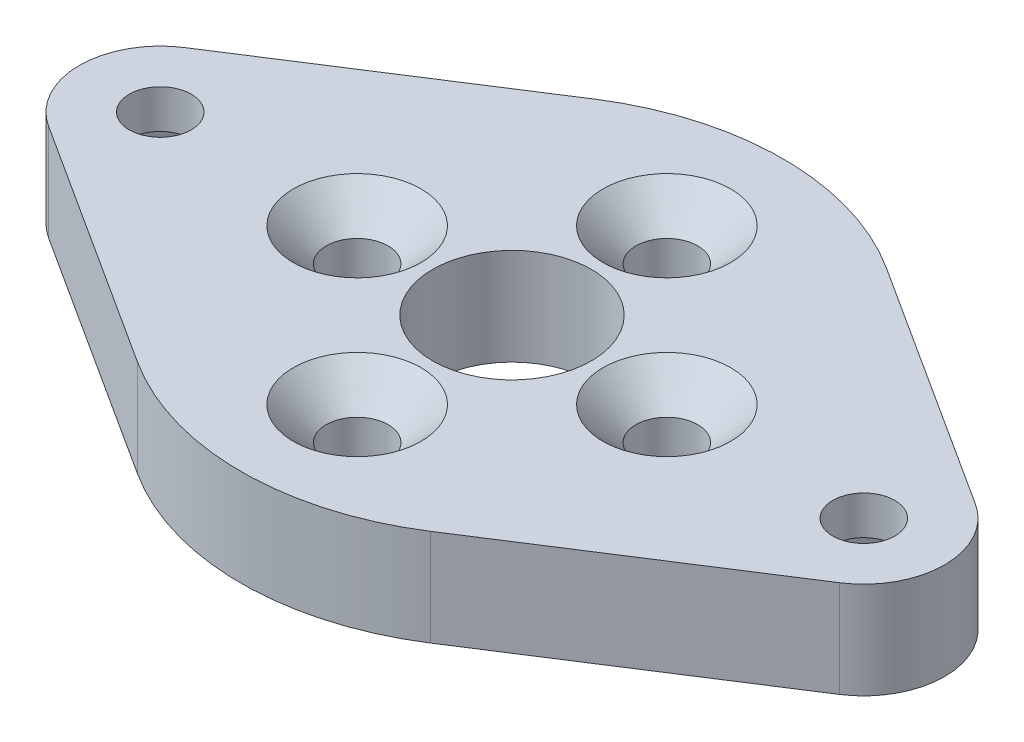
ISO-10303-21;
HEADER;
FILE_DESCRIPTION(('STEP AP214'),'2;1');
FILE_NAME('part.step','',(''),(''),'','','');
FILE_SCHEMA(('AUTOMOTIVE_DESIGN { 1 0 10303 214 1 1 1 1 }'));
ENDSEC;
DATA;
#1=APPLICATION_CONTEXT('core data for automotive mechanical design processes');
#2=APPLICATION_PROTOCOL_DEFINITION('international standard','automotive_design',2000,#1);
#3=PRODUCT_CONTEXT('',#1,'mechanical');
#4=PRODUCT('Part','Part','',(#3));
#5=PRODUCT_RELATED_PRODUCT_CATEGORY('part','',(#4));
#6=PRODUCT_DEFINITION_FORMATION('','',#4);
#7=PRODUCT_DEFINITION_CONTEXT('part definition',#1,'design');
#8=PRODUCT_DEFINITION('design','',#6,#7);
#9=PRODUCT_DEFINITION_SHAPE('','',#8);
#10=(LENGTH_UNIT() NAMED_UNIT(*) SI_UNIT(.MILLI.,.METRE.));
#11=(NAMED_UNIT(*) PLANE_ANGLE_UNIT() SI_UNIT($,.RADIAN.));
#12=(NAMED_UNIT(*) SI_UNIT($,.STERADIAN.) SOLID_ANGLE_UNIT());
#13=UNCERTAINTY_MEASURE_WITH_UNIT(LENGTH_MEASURE(1.E-05),#10,'distance_accuracy_value','');
#14=(GEOMETRIC_REPRESENTATION_CONTEXT(3) GLOBAL_UNCERTAINTY_ASSIGNED_CONTEXT((#13)) GLOBAL_UNIT_ASSIGNED_CONTEXT((#10,
#11,#12)) REPRESENTATION_CONTEXT('',''));
#15=CARTESIAN_POINT('',(0.,0.,0.));
#16=DIRECTION('',(0.,0.,1.));
#17=DIRECTION('',(1.,0.,0.));
#18=AXIS2_PLACEMENT_3D('',#15,#16,#17);
#19=CARTESIAN_POINT('',(-18.1754264805429,5.,0.));
#20=DIRECTION('',(0.,-1.,0.));
#21=DIRECTION('',(0.,0.,-1.));
#22=AXIS2_PLACEMENT_3D('',#19,#20,#21);
#23=CYLINDRICAL_SURFACE('',#22,1.6);
#24=CARTESIAN_POINT('',(-18.1754264805429,5.,0.));
#25=DIRECTION('',(0.,1.,0.));
#26=DIRECTION('',(0.,0.,1.));
#27=AXIS2_PLACEMENT_3D('',#24,#25,#26);
#28=CIRCLE('',#27,1.6);
#29=CARTESIAN_POINT('',(-18.1754264805429,5.,1.6));
#30=VERTEX_POINT('',#29);
#31=EDGE_CURVE('E284',#30,#30,#28,.T.);
#32=ORIENTED_EDGE('',*,*,#31,.T.);
#33=EDGE_LOOP('',(#32));
#34=FACE_BOUND('',#33,.T.);
#35=CARTESIAN_POINT('',(-18.1754264805429,3.,0.));
#36=DIRECTION('',(0.,-1.,0.));
#37=DIRECTION('',(0.,0.,-1.));
#38=AXIS2_PLACEMENT_3D('',#35,#36,#37);
#39=CIRCLE('',#38,1.6);
#40=CARTESIAN_POINT('',(-18.1754264805429,3.,-1.6));
#41=VERTEX_POINT('',#40);
#42=EDGE_CURVE('E42',#41,#41,#39,.T.);
#43=ORIENTED_EDGE('',*,*,#42,.T.);
#44=EDGE_LOOP('',(#43));
#45=FACE_BOUND('',#44,.T.);
#46=ADVANCED_FACE('F37',(#34,#45),#23,.F.);
#47=CARTESIAN_POINT('',(18.1754264805429,5.,0.));
#48=DIRECTION('',(0.,-1.,0.));
#49=DIRECTION('',(0.,0.,-1.));
#50=AXIS2_PLACEMENT_3D('',#47,#48,#49);
#51=CYLINDRICAL_SURFACE('',#50,1.6);
#52=CARTESIAN_POINT('',(18.1754264805429,5.,0.));
#53=DIRECTION('',(0.,1.,0.));
#54=DIRECTION('',(0.,0.,1.));
#55=AXIS2_PLACEMENT_3D('',#52,#53,#54);
#56=CIRCLE('',#55,1.6);
#57=CARTESIAN_POINT('',(18.1754264805429,5.,1.59999999999999));
#58=VERTEX_POINT('',#57);
#59=EDGE_CURVE('E281',#58,#58,#56,.T.);
#60=ORIENTED_EDGE('',*,*,#59,.T.);
#61=EDGE_LOOP('',(#60));
#62=FACE_BOUND('',#61,.T.);
#63=CARTESIAN_POINT('',(18.1754264805429,3.,0.));
#64=DIRECTION('',(0.,-1.,0.));
#65=DIRECTION('',(0.,0.,-1.));
#66=AXIS2_PLACEMENT_3D('',#63,#64,#65);
#67=CIRCLE('',#66,1.6);
#68=CARTESIAN_POINT('',(18.1754264805429,3.,-1.60000000000001));
#69=VERTEX_POINT('',#68);
#70=EDGE_CURVE('E225',#69,#69,#67,.T.);
#71=ORIENTED_EDGE('',*,*,#70,.T.);
#72=EDGE_LOOP('',(#71));
#73=FACE_BOUND('',#72,.T.);
#74=ADVANCED_FACE('F395',(#62,#73),#51,.F.);
#75=CARTESIAN_POINT('',(18.1754264805429,5.,0.));
#76=DIRECTION('',(0.,-1.,0.));
#77=DIRECTION('',(0.,0.,-1.));
#78=AXIS2_PLACEMENT_3D('',#75,#76,#77);
#79=PLANE('',#78);
#80=CARTESIAN_POINT('',(-8.,5.,0.));
#81=DIRECTION('',(0.,-1.,0.));
#82=DIRECTION('',(0.,0.,-1.));
#83=AXIS2_PLACEMENT_3D('',#80,#81,#82);
#84=CIRCLE('',#83,3.30000000000001);
#85=CARTESIAN_POINT('',(-8.,5.,-3.30000000000001));
#86=VERTEX_POINT('',#85);
#87=EDGE_CURVE('E372',#86,#86,#84,.T.);
#88=ORIENTED_EDGE('',*,*,#87,.T.);
#89=EDGE_LOOP('',(#88));
#90=FACE_BOUND('',#89,.T.);
#91=CARTESIAN_POINT('',(0.,5.,-8.));
#92=DIRECTION('',(0.,-1.,0.));
#93=DIRECTION('',(0.,0.,-1.));
#94=AXIS2_PLACEMENT_3D('',#91,#92,#93);
#95=CIRCLE('',#94,3.30000000000001);
#96=CARTESIAN_POINT('',(0.,5.,-11.3));
#97=VERTEX_POINT('',#96);
#98=EDGE_CURVE('E369',#97,#97,#95,.T.);
#99=ORIENTED_EDGE('',*,*,#98,.T.);
#100=EDGE_LOOP('',(#99));
#101=FACE_BOUND('',#100,.T.);
#102=CARTESIAN_POINT('',(8.,5.,0.));
#103=DIRECTION('',(0.,-1.,0.));
#104=DIRECTION('',(0.,0.,-1.));
#105=AXIS2_PLACEMENT_3D('',#102,#103,#104);
#106=CIRCLE('',#105,3.30000000000001);
#107=CARTESIAN_POINT('',(8.,5.,-3.30000000000001));
#108=VERTEX_POINT('',#107);
#109=EDGE_CURVE('E366',#108,#108,#106,.T.);
#110=ORIENTED_EDGE('',*,*,#109,.T.);
#111=EDGE_LOOP('',(#110));
#112=FACE_BOUND('',#111,.T.);
#113=CARTESIAN_POINT('',(0.,5.,8.));
#114=DIRECTION('',(0.,-1.,0.));
#115=DIRECTION('',(0.,0.,-1.));
#116=AXIS2_PLACEMENT_3D('',#113,#114,#115);
#117=CIRCLE('',#116,3.30000000000001);
#118=CARTESIAN_POINT('',(0.,5.,4.69999999999999));
#119=VERTEX_POINT('',#118);
#120=EDGE_CURVE('E363',#119,#119,#117,.T.);
#121=ORIENTED_EDGE('',*,*,#120,.T.);
#122=EDGE_LOOP('',(#121));
#123=FACE_BOUND('',#122,.T.);
#124=CARTESIAN_POINT('',(18.1754264805429,5.,0.));
#125=DIRECTION('',(0.,1.,0.));
#126=DIRECTION('',(0.,0.,-1.));
#127=AXIS2_PLACEMENT_3D('',#124,#125,#126);
#128=CIRCLE('',#127,4.17542648054294);
#129=CARTESIAN_POINT('',(20.4324180552439,5.,3.51285856905002));
#130=VERTEX_POINT('',#129);
#131=CARTESIAN_POINT('',(20.4324180552439,5.,-3.51285856905002));
#132=VERTEX_POINT('',#131);
#133=EDGE_CURVE('E303',#130,#132,#128,.T.);
#134=ORIENTED_EDGE('',*,*,#133,.T.);
#135=DIRECTION('',(-0.841317308643699,0.,-0.540541567482579));
#136=VECTOR('',#135,1.);
#137=CARTESIAN_POINT('',(20.4324180552439,5.,-3.51285856905002));
#138=LINE('',#137,#136);
#139=CARTESIAN_POINT('',(7.56758194475611,5.,-11.7784423210118));
#140=VERTEX_POINT('',#139);
#141=EDGE_CURVE('E306',#132,#140,#138,.T.);
#142=ORIENTED_EDGE('',*,*,#141,.T.);
#143=CARTESIAN_POINT('',(0.,5.,0.));
#144=DIRECTION('',(0.,1.,0.));
#145=DIRECTION('',(0.,0.,1.));
#146=AXIS2_PLACEMENT_3D('',#143,#144,#145);
#147=CIRCLE('',#146,14.);
#148=CARTESIAN_POINT('',(-7.56758194475611,5.,-11.7784423210118));
#149=VERTEX_POINT('',#148);
#150=EDGE_CURVE('E309',#140,#149,#147,.T.);
#151=ORIENTED_EDGE('',*,*,#150,.T.);
#152=DIRECTION('',(-0.841317308643699,0.,0.540541567482579));
#153=VECTOR('',#152,1.);
#154=CARTESIAN_POINT('',(-20.4324180552439,5.,-3.51285856905002));
#155=LINE('',#154,#153);
#156=CARTESIAN_POINT('',(-20.4324180552439,5.,-3.51285856905002));
#157=VERTEX_POINT('',#156);
#158=EDGE_CURVE('E311',#149,#157,#155,.T.);
#159=ORIENTED_EDGE('',*,*,#158,.T.);
#160=CARTESIAN_POINT('',(-18.1754264805429,5.,0.));
#161=DIRECTION('',(0.,1.,0.));
#162=DIRECTION('',(0.,0.,1.));
#163=AXIS2_PLACEMENT_3D('',#160,#161,#162);
#164=CIRCLE('',#163,4.17542648054294);
#165=CARTESIAN_POINT('',(-20.4324180552439,5.,3.51285856905002));
#166=VERTEX_POINT('',#165);
#167=EDGE_CURVE('E313',#157,#166,#164,.T.);
#168=ORIENTED_EDGE('',*,*,#167,.T.);
#169=DIRECTION('',(0.841317308643699,0.,0.540541567482579));
#170=VECTOR('',#169,1.);
#171=CARTESIAN_POINT('',(-20.4324180552439,5.,3.51285856905002));
#172=LINE('',#171,#170);
#173=CARTESIAN_POINT('',(-7.5675819447561,5.,11.7784423210118));
#174=VERTEX_POINT('',#173);
#175=EDGE_CURVE('E315',#166,#174,#172,.T.);
#176=ORIENTED_EDGE('',*,*,#175,.T.);
#177=CARTESIAN_POINT('',(0.,5.,0.));
#178=DIRECTION('',(0.,1.,0.));
#179=DIRECTION('',(0.,0.,1.));
#180=AXIS2_PLACEMENT_3D('',#177,#178,#179);
#181=CIRCLE('',#180,14.);
#182=CARTESIAN_POINT('',(7.56758194475611,5.,11.7784423210118));
#183=VERTEX_POINT('',#182);
#184=EDGE_CURVE('E317',#174,#183,#181,.T.);
#185=ORIENTED_EDGE('',*,*,#184,.T.);
#186=DIRECTION('',(0.841317308643699,0.,-0.540541567482579));
#187=VECTOR('',#186,1.);
#188=CARTESIAN_POINT('',(20.4324180552439,5.,3.51285856905002));
#189=LINE('',#188,#187);
#190=EDGE_CURVE('E319',#183,#130,#189,.T.);
#191=ORIENTED_EDGE('',*,*,#190,.T.);
#192=EDGE_LOOP('',(#134,#142,#151,#159,#168,#176,#185,#191));
#193=FACE_BOUND('',#192,.T.);
#194=CARTESIAN_POINT('',(0.,5.,0.));
#195=DIRECTION('',(0.,1.,0.));
#196=DIRECTION('',(0.,0.,1.));
#197=AXIS2_PLACEMENT_3D('',#194,#195,#196);
#198=CIRCLE('',#197,4.1);
#199=CARTESIAN_POINT('',(0.,5.,4.1));
#200=VERTEX_POINT('',#199);
#201=EDGE_CURVE('E297',#200,#200,#198,.T.);
#202=ORIENTED_EDGE('',*,*,#201,.F.);
#203=EDGE_LOOP('',(#202));
#204=FACE_BOUND('',#203,.T.);
#205=ORIENTED_EDGE('',*,*,#31,.F.);
#206=EDGE_LOOP('',(#205));
#207=FACE_BOUND('',#206,.T.);
#208=ORIENTED_EDGE('',*,*,#59,.F.);
#209=EDGE_LOOP('',(#208));
#210=FACE_BOUND('',#209,.T.);
#211=ADVANCED_FACE('F401',(#90,#101,#112,#123,#193,#204,#207,#210),#79,.F.);
#212=CARTESIAN_POINT('',(18.1754264805429,0.,0.));
#213=DIRECTION('',(0.,-1.,0.));
#214=DIRECTION('',(0.,0.,-1.));
#215=AXIS2_PLACEMENT_3D('',#212,#213,#214);
#216=PLANE('',#215);
#217=DIRECTION('',(0.5,0.,0.866025403784438));
#218=VECTOR('',#217,1.);
#219=CARTESIAN_POINT('',(-16.5877132402715,0.,-2.75));
#220=LINE('',#219,#218);
#221=CARTESIAN_POINT('',(-16.5877132402715,0.,-2.75));
#222=VERTEX_POINT('',#221);
#223=CARTESIAN_POINT('',(-15.,0.,0.));
#224=VERTEX_POINT('',#223);
#225=EDGE_CURVE('E55',#222,#224,#220,.T.);
#226=ORIENTED_EDGE('',*,*,#225,.F.);
#227=DIRECTION('',(1.,0.,0.));
#228=VECTOR('',#227,1.);
#229=CARTESIAN_POINT('',(-19.7631397208144,0.,-2.75));
#230=LINE('',#229,#228);
#231=CARTESIAN_POINT('',(-19.7631397208144,0.,-2.75));
#232=VERTEX_POINT('',#231);
#233=EDGE_CURVE('E198',#232,#222,#230,.T.);
#234=ORIENTED_EDGE('',*,*,#233,.F.);
#235=DIRECTION('',(0.5,0.,-0.866025403784438));
#236=VECTOR('',#235,1.);
#237=CARTESIAN_POINT('',(-21.3508529610859,0.,0.));
#238=LINE('',#237,#236);
#239=CARTESIAN_POINT('',(-21.3508529610859,0.,0.));
#240=VERTEX_POINT('',#239);
#241=EDGE_CURVE('E201',#240,#232,#238,.T.);
#242=ORIENTED_EDGE('',*,*,#241,.F.);
#243=DIRECTION('',(-0.5,0.,-0.866025403784438));
#244=VECTOR('',#243,1.);
#245=CARTESIAN_POINT('',(-19.7631397208144,0.,2.75));
#246=LINE('',#245,#244);
#247=CARTESIAN_POINT('',(-19.7631397208144,0.,2.75));
#248=VERTEX_POINT('',#247);
#249=EDGE_CURVE('E218',#248,#240,#246,.T.);
#250=ORIENTED_EDGE('',*,*,#249,.F.);
#251=DIRECTION('',(-1.,0.,0.));
#252=VECTOR('',#251,1.);
#253=CARTESIAN_POINT('',(-16.5877132402715,0.,2.75));
#254=LINE('',#253,#252);
#255=CARTESIAN_POINT('',(-16.5877132402715,0.,2.75));
#256=VERTEX_POINT('',#255);
#257=EDGE_CURVE('E215',#256,#248,#254,.T.);
#258=ORIENTED_EDGE('',*,*,#257,.F.);
#259=DIRECTION('',(-0.5,0.,0.866025403784438));
#260=VECTOR('',#259,1.);
#261=CARTESIAN_POINT('',(-15.,0.,0.));
#262=LINE('',#261,#260);
#263=EDGE_CURVE('E212',#224,#256,#262,.T.);
#264=ORIENTED_EDGE('',*,*,#263,.F.);
#265=EDGE_LOOP('',(#226,#234,#242,#250,#258,#264));
#266=FACE_BOUND('',#265,.T.);
#267=DIRECTION('',(-0.5,0.,-0.866025403784439));
#268=VECTOR('',#267,1.);
#269=CARTESIAN_POINT('',(16.5877132402715,0.,2.74999999999998));
#270=LINE('',#269,#268);
#271=CARTESIAN_POINT('',(16.5877132402715,0.,2.74999999999998));
#272=VERTEX_POINT('',#271);
#273=CARTESIAN_POINT('',(15.,0.,0.));
#274=VERTEX_POINT('',#273);
#275=EDGE_CURVE('E63',#272,#274,#270,.T.);
#276=ORIENTED_EDGE('',*,*,#275,.F.);
#277=DIRECTION('',(-1.,0.,0.));
#278=VECTOR('',#277,1.);
#279=CARTESIAN_POINT('',(19.7631397208144,0.,2.74999999999998));
#280=LINE('',#279,#278);
#281=CARTESIAN_POINT('',(19.7631397208144,0.,2.74999999999998));
#282=VERTEX_POINT('',#281);
#283=EDGE_CURVE('E237',#282,#272,#280,.T.);
#284=ORIENTED_EDGE('',*,*,#283,.F.);
#285=DIRECTION('',(-0.5,0.,0.866025403784439));
#286=VECTOR('',#285,1.);
#287=CARTESIAN_POINT('',(21.3508529610859,0.,0.));
#288=LINE('',#287,#286);
#289=CARTESIAN_POINT('',(21.3508529610859,0.,0.));
#290=VERTEX_POINT('',#289);
#291=EDGE_CURVE('E263',#290,#282,#288,.T.);
#292=ORIENTED_EDGE('',*,*,#291,.F.);
#293=DIRECTION('',(0.499999999999999,0.,0.866025403784439));
#294=VECTOR('',#293,1.);
#295=CARTESIAN_POINT('',(19.7631397208144,0.,-2.75));
#296=LINE('',#295,#294);
#297=CARTESIAN_POINT('',(19.7631397208144,0.,-2.75));
#298=VERTEX_POINT('',#297);
#299=EDGE_CURVE('E260',#298,#290,#296,.T.);
#300=ORIENTED_EDGE('',*,*,#299,.F.);
#301=DIRECTION('',(1.,0.,0.));
#302=VECTOR('',#301,1.);
#303=CARTESIAN_POINT('',(16.5877132402715,0.,-2.75));
#304=LINE('',#303,#302);
#305=CARTESIAN_POINT('',(16.5877132402715,0.,-2.75));
#306=VERTEX_POINT('',#305);
#307=EDGE_CURVE('E257',#306,#298,#304,.T.);
#308=ORIENTED_EDGE('',*,*,#307,.F.);
#309=DIRECTION('',(0.5,0.,-0.866025403784438));
#310=VECTOR('',#309,1.);
#311=CARTESIAN_POINT('',(15.,0.,0.));
#312=LINE('',#311,#310);
#313=EDGE_CURVE('E254',#274,#306,#312,.T.);
#314=ORIENTED_EDGE('',*,*,#313,.F.);
#315=EDGE_LOOP('',(#276,#284,#292,#300,#308,#314));
#316=FACE_BOUND('',#315,.T.);
#317=CARTESIAN_POINT('',(0.,0.,8.));
#318=DIRECTION('',(0.,1.,0.));
#319=DIRECTION('',(0.,0.,1.));
#320=AXIS2_PLACEMENT_3D('',#317,#318,#319);
#321=CIRCLE('',#320,1.6);
#322=CARTESIAN_POINT('',(0.,0.,9.6));
#323=VERTEX_POINT('',#322);
#324=EDGE_CURVE('E287',#323,#323,#321,.T.);
#325=ORIENTED_EDGE('',*,*,#324,.T.);
#326=EDGE_LOOP('',(#325));
#327=FACE_BOUND('',#326,.T.);
#328=CARTESIAN_POINT('',(0.,0.,-8.));
#329=DIRECTION('',(0.,1.,0.));
#330=DIRECTION('',(0.,0.,1.));
#331=AXIS2_PLACEMENT_3D('',#328,#329,#330);
#332=CIRCLE('',#331,1.6);
#333=CARTESIAN_POINT('',(0.,0.,-6.4));
#334=VERTEX_POINT('',#333);
#335=EDGE_CURVE('E293',#334,#334,#332,.T.);
#336=ORIENTED_EDGE('',*,*,#335,.T.);
#337=EDGE_LOOP('',(#336));
#338=FACE_BOUND('',#337,.T.);
#339=CARTESIAN_POINT('',(18.1754264805429,0.,0.));
#340=DIRECTION('',(0.,1.,0.));
#341=DIRECTION('',(0.,0.,-1.));
#342=AXIS2_PLACEMENT_3D('',#339,#340,#341);
#343=CIRCLE('',#342,4.17542648054294);
#344=CARTESIAN_POINT('',(20.4324180552439,0.,3.51285856905002));
#345=VERTEX_POINT('',#344);
#346=CARTESIAN_POINT('',(20.4324180552439,0.,-3.51285856905002));
#347=VERTEX_POINT('',#346);
#348=EDGE_CURVE('E300',#345,#347,#343,.T.);
#349=ORIENTED_EDGE('',*,*,#348,.F.);
#350=DIRECTION('',(0.841317308643699,0.,-0.540541567482579));
#351=VECTOR('',#350,1.);
#352=CARTESIAN_POINT('',(20.4324180552439,0.,3.51285856905002));
#353=LINE('',#352,#351);
#354=CARTESIAN_POINT('',(7.56758194475611,0.,11.7784423210118));
#355=VERTEX_POINT('',#354);
#356=EDGE_CURVE('E307',#355,#345,#353,.T.);
#357=ORIENTED_EDGE('',*,*,#356,.F.);
#358=CARTESIAN_POINT('',(0.,0.,0.));
#359=DIRECTION('',(0.,1.,0.));
#360=DIRECTION('',(0.,0.,1.));
#361=AXIS2_PLACEMENT_3D('',#358,#359,#360);
#362=CIRCLE('',#361,14.);
#363=CARTESIAN_POINT('',(-7.5675819447561,0.,11.7784423210118));
#364=VERTEX_POINT('',#363);
#365=EDGE_CURVE('E334',#364,#355,#362,.T.);
#366=ORIENTED_EDGE('',*,*,#365,.F.);
#367=DIRECTION('',(0.841317308643699,0.,0.540541567482579));
#368=VECTOR('',#367,1.);
#369=CARTESIAN_POINT('',(-20.4324180552439,0.,3.51285856905002));
#370=LINE('',#369,#368);
#371=CARTESIAN_POINT('',(-20.4324180552439,0.,3.51285856905002));
#372=VERTEX_POINT('',#371);
#373=EDGE_CURVE('E332',#372,#364,#370,.T.);
#374=ORIENTED_EDGE('',*,*,#373,.F.);
#375=CARTESIAN_POINT('',(-18.1754264805429,0.,0.));
#376=DIRECTION('',(0.,1.,0.));
#377=DIRECTION('',(0.,0.,1.));
#378=AXIS2_PLACEMENT_3D('',#375,#376,#377);
#379=CIRCLE('',#378,4.17542648054294);
#380=CARTESIAN_POINT('',(-20.4324180552439,0.,-3.51285856905002));
#381=VERTEX_POINT('',#380);
#382=EDGE_CURVE('E330',#381,#372,#379,.T.);
#383=ORIENTED_EDGE('',*,*,#382,.F.);
#384=DIRECTION('',(-0.841317308643699,0.,0.540541567482579));
#385=VECTOR('',#384,1.);
#386=CARTESIAN_POINT('',(-20.4324180552439,0.,-3.51285856905002));
#387=LINE('',#386,#385);
#388=CARTESIAN_POINT('',(-7.56758194475611,0.,-11.7784423210118));
#389=VERTEX_POINT('',#388);
#390=EDGE_CURVE('E328',#389,#381,#387,.T.);
#391=ORIENTED_EDGE('',*,*,#390,.F.);
#392=CARTESIAN_POINT('',(0.,0.,0.));
#393=DIRECTION('',(0.,1.,0.));
#394=DIRECTION('',(0.,0.,1.));
#395=AXIS2_PLACEMENT_3D('',#392,#393,#394);
#396=CIRCLE('',#395,14.);
#397=CARTESIAN_POINT('',(7.56758194475611,0.,-11.7784423210118));
#398=VERTEX_POINT('',#397);
#399=EDGE_CURVE('E326',#398,#389,#396,.T.);
#400=ORIENTED_EDGE('',*,*,#399,.F.);
#401=DIRECTION('',(-0.841317308643699,0.,-0.540541567482579));
#402=VECTOR('',#401,1.);
#403=CARTESIAN_POINT('',(20.4324180552439,0.,-3.51285856905002));
#404=LINE('',#403,#402);
#405=EDGE_CURVE('E324',#347,#398,#404,.T.);
#406=ORIENTED_EDGE('',*,*,#405,.F.);
#407=EDGE_LOOP('',(#349,#357,#366,#374,#383,#391,#400,#406));
#408=FACE_BOUND('',#407,.T.);
#409=CARTESIAN_POINT('',(0.,0.,0.));
#410=DIRECTION('',(0.,1.,0.));
#411=DIRECTION('',(0.,0.,1.));
#412=AXIS2_PLACEMENT_3D('',#409,#410,#411);
#413=CIRCLE('',#412,4.1);
#414=CARTESIAN_POINT('',(0.,0.,4.1));
#415=VERTEX_POINT('',#414);
#416=EDGE_CURVE('E296',#415,#415,#413,.T.);
#417=ORIENTED_EDGE('',*,*,#416,.T.);
#418=EDGE_LOOP('',(#417));
#419=FACE_BOUND('',#418,.T.);
#420=CARTESIAN_POINT('',(8.,0.,0.));
#421=DIRECTION('',(0.,1.,0.));
#422=DIRECTION('',(0.,0.,1.));
#423=AXIS2_PLACEMENT_3D('',#420,#421,#422);
#424=CIRCLE('',#423,1.6);
#425=CARTESIAN_POINT('',(8.,0.,1.6));
#426=VERTEX_POINT('',#425);
#427=EDGE_CURVE('E290',#426,#426,#424,.T.);
#428=ORIENTED_EDGE('',*,*,#427,.T.);
#429=EDGE_LOOP('',(#428));
#430=FACE_BOUND('',#429,.T.);
#431=CARTESIAN_POINT('',(-8.,0.,0.));
#432=DIRECTION('',(0.,1.,0.));
#433=DIRECTION('',(0.,0.,1.));
#434=AXIS2_PLACEMENT_3D('',#431,#432,#433);
#435=CIRCLE('',#434,1.6);
#436=CARTESIAN_POINT('',(-8.,0.,1.6));
#437=VERTEX_POINT('',#436);
#438=EDGE_CURVE('E278',#437,#437,#435,.T.);
#439=ORIENTED_EDGE('',*,*,#438,.T.);
#440=EDGE_LOOP('',(#439));
#441=FACE_BOUND('',#440,.T.);
#442=ADVANCED_FACE('F426',(#266,#316,#327,#338,#408,#419,#430,#441),#216,.T.);
#443=CARTESIAN_POINT('',(18.1754264805429,5.,0.));
#444=DIRECTION('',(0.,-1.,0.));
#445=DIRECTION('',(0.,0.,-1.));
#446=AXIS2_PLACEMENT_3D('',#443,#444,#445);
#447=CYLINDRICAL_SURFACE('',#446,4.17542648054294);
#448=ORIENTED_EDGE('',*,*,#348,.T.);
#449=DIRECTION('',(0.,-1.,0.));
#450=VECTOR('',#449,1.);
#451=CARTESIAN_POINT('',(20.4324180552439,5.,-3.51285856905002));
#452=LINE('',#451,#450);
#453=EDGE_CURVE('E357',#132,#347,#452,.T.);
#454=ORIENTED_EDGE('',*,*,#453,.F.);
#455=ORIENTED_EDGE('',*,*,#133,.F.);
#456=DIRECTION('',(0.,-1.,0.));
#457=VECTOR('',#456,1.);
#458=CARTESIAN_POINT('',(20.4324180552439,5.,3.51285856905002));
#459=LINE('',#458,#457);
#460=EDGE_CURVE('E321',#130,#345,#459,.T.);
#461=ORIENTED_EDGE('',*,*,#460,.T.);
#462=EDGE_LOOP('',(#448,#454,#455,#461));
#463=FACE_BOUND('',#462,.T.);
#464=ADVANCED_FACE('F430',(#463),#447,.T.);
#465=CARTESIAN_POINT('',(20.4324180552439,5.,-3.51285856905002));
#466=DIRECTION('',(-0.540541567482579,0.,0.841317308643699));
#467=DIRECTION('',(0.841317308643699,0.,0.540541567482579));
#468=AXIS2_PLACEMENT_3D('',#465,#466,#467);
#469=PLANE('',#468);
#470=ORIENTED_EDGE('',*,*,#405,.T.);
#471=DIRECTION('',(0.,-1.,0.));
#472=VECTOR('',#471,1.);
#473=CARTESIAN_POINT('',(7.56758194475611,5.,-11.7784423210118));
#474=LINE('',#473,#472);
#475=EDGE_CURVE('E354',#140,#398,#474,.T.);
#476=ORIENTED_EDGE('',*,*,#475,.F.);
#477=ORIENTED_EDGE('',*,*,#141,.F.);
#478=ORIENTED_EDGE('',*,*,#453,.T.);
#479=EDGE_LOOP('',(#470,#476,#477,#478));
#480=FACE_BOUND('',#479,.T.);
#481=ADVANCED_FACE('F454',(#480),#469,.F.);
#482=CARTESIAN_POINT('',(0.,5.,0.));
#483=DIRECTION('',(0.,-1.,0.));
#484=DIRECTION('',(0.,0.,-1.));
#485=AXIS2_PLACEMENT_3D('',#482,#483,#484);
#486=CYLINDRICAL_SURFACE('',#485,14.);
#487=ORIENTED_EDGE('',*,*,#399,.T.);
#488=DIRECTION('',(0.,-1.,0.));
#489=VECTOR('',#488,1.);
#490=CARTESIAN_POINT('',(-7.56758194475611,5.,-11.7784423210118));
#491=LINE('',#490,#489);
#492=EDGE_CURVE('E351',#149,#389,#491,.T.);
#493=ORIENTED_EDGE('',*,*,#492,.F.);
#494=ORIENTED_EDGE('',*,*,#150,.F.);
#495=ORIENTED_EDGE('',*,*,#475,.T.);
#496=EDGE_LOOP('',(#487,#493,#494,#495));
#497=FACE_BOUND('',#496,.T.);
#498=ADVANCED_FACE('F450',(#497),#486,.T.);
#499=CARTESIAN_POINT('',(-20.4324180552439,5.,-3.51285856905002));
#500=DIRECTION('',(0.540541567482579,0.,0.841317308643699));
#501=DIRECTION('',(0.841317308643699,0.,-0.540541567482579));
#502=AXIS2_PLACEMENT_3D('',#499,#500,#501);
#503=PLANE('',#502);
#504=ORIENTED_EDGE('',*,*,#390,.T.);
#505=DIRECTION('',(0.,-1.,0.));
#506=VECTOR('',#505,1.);
#507=CARTESIAN_POINT('',(-20.4324180552439,5.,-3.51285856905002));
#508=LINE('',#507,#506);
#509=EDGE_CURVE('E348',#157,#381,#508,.T.);
#510=ORIENTED_EDGE('',*,*,#509,.F.);
#511=ORIENTED_EDGE('',*,*,#158,.F.);
#512=ORIENTED_EDGE('',*,*,#492,.T.);
#513=EDGE_LOOP('',(#504,#510,#511,#512));
#514=FACE_BOUND('',#513,.T.);
#515=ADVANCED_FACE('F446',(#514),#503,.F.);
#516=CARTESIAN_POINT('',(-18.1754264805429,5.,0.));
#517=DIRECTION('',(0.,-1.,0.));
#518=DIRECTION('',(0.,0.,-1.));
#519=AXIS2_PLACEMENT_3D('',#516,#517,#518);
#520=CYLINDRICAL_SURFACE('',#519,4.17542648054294);
#521=ORIENTED_EDGE('',*,*,#382,.T.);
#522=DIRECTION('',(0.,-1.,0.));
#523=VECTOR('',#522,1.);
#524=CARTESIAN_POINT('',(-20.4324180552439,5.,3.51285856905002));
#525=LINE('',#524,#523);
#526=EDGE_CURVE('E345',#166,#372,#525,.T.);
#527=ORIENTED_EDGE('',*,*,#526,.F.);
#528=ORIENTED_EDGE('',*,*,#167,.F.);
#529=ORIENTED_EDGE('',*,*,#509,.T.);
#530=EDGE_LOOP('',(#521,#527,#528,#529));
#531=FACE_BOUND('',#530,.T.);
#532=ADVANCED_FACE('F442',(#531),#520,.T.);
#533=CARTESIAN_POINT('',(-20.4324180552439,5.,3.51285856905002));
#534=DIRECTION('',(0.540541567482579,0.,-0.841317308643699));
#535=DIRECTION('',(-0.841317308643699,0.,-0.540541567482579));
#536=AXIS2_PLACEMENT_3D('',#533,#534,#535);
#537=PLANE('',#536);
#538=ORIENTED_EDGE('',*,*,#373,.T.);
#539=DIRECTION('',(0.,-1.,0.));
#540=VECTOR('',#539,1.);
#541=CARTESIAN_POINT('',(-7.5675819447561,5.,11.7784423210118));
#542=LINE('',#541,#540);
#543=EDGE_CURVE('E342',#174,#364,#542,.T.);
#544=ORIENTED_EDGE('',*,*,#543,.F.);
#545=ORIENTED_EDGE('',*,*,#175,.F.);
#546=ORIENTED_EDGE('',*,*,#526,.T.);
#547=EDGE_LOOP('',(#538,#544,#545,#546));
#548=FACE_BOUND('',#547,.T.);
#549=ADVANCED_FACE('F438',(#548),#537,.F.);
#550=CARTESIAN_POINT('',(0.,5.,0.));
#551=DIRECTION('',(0.,-1.,0.));
#552=DIRECTION('',(0.,0.,-1.));
#553=AXIS2_PLACEMENT_3D('',#550,#551,#552);
#554=CYLINDRICAL_SURFACE('',#553,14.);
#555=ORIENTED_EDGE('',*,*,#365,.T.);
#556=DIRECTION('',(0.,-1.,0.));
#557=VECTOR('',#556,1.);
#558=CARTESIAN_POINT('',(7.56758194475611,5.,11.7784423210118));
#559=LINE('',#558,#557);
#560=EDGE_CURVE('E339',#183,#355,#559,.T.);
#561=ORIENTED_EDGE('',*,*,#560,.F.);
#562=ORIENTED_EDGE('',*,*,#184,.F.);
#563=ORIENTED_EDGE('',*,*,#543,.T.);
#564=EDGE_LOOP('',(#555,#561,#562,#563));
#565=FACE_BOUND('',#564,.T.);
#566=ADVANCED_FACE('F434',(#565),#554,.T.);
#567=CARTESIAN_POINT('',(20.4324180552439,5.,3.51285856905002));
#568=DIRECTION('',(-0.540541567482579,0.,-0.841317308643699));
#569=DIRECTION('',(-0.841317308643699,0.,0.540541567482579));
#570=AXIS2_PLACEMENT_3D('',#567,#568,#569);
#571=PLANE('',#570);
#572=ORIENTED_EDGE('',*,*,#356,.T.);
#573=ORIENTED_EDGE('',*,*,#460,.F.);
#574=ORIENTED_EDGE('',*,*,#190,.F.);
#575=ORIENTED_EDGE('',*,*,#560,.T.);
#576=EDGE_LOOP('',(#572,#573,#574,#575));
#577=FACE_BOUND('',#576,.T.);
#578=ADVANCED_FACE('F422',(#577),#571,.F.);
#579=CARTESIAN_POINT('',(0.,5.,0.));
#580=DIRECTION('',(0.,-1.,0.));
#581=DIRECTION('',(0.,0.,-1.));
#582=AXIS2_PLACEMENT_3D('',#579,#580,#581);
#583=CYLINDRICAL_SURFACE('',#582,4.1);
#584=ORIENTED_EDGE('',*,*,#201,.T.);
#585=EDGE_LOOP('',(#584));
#586=FACE_BOUND('',#585,.T.);
#587=ORIENTED_EDGE('',*,*,#416,.F.);
#588=EDGE_LOOP('',(#587));
#589=FACE_BOUND('',#588,.T.);
#590=ADVANCED_FACE('F418',(#586,#589),#583,.F.);
#591=CARTESIAN_POINT('',(0.,5.,-8.));
#592=DIRECTION('',(0.,-1.,0.));
#593=DIRECTION('',(0.,0.,-1.));
#594=AXIS2_PLACEMENT_3D('',#591,#592,#593);
#595=CYLINDRICAL_SURFACE('',#594,1.6);
#596=CARTESIAN_POINT('',(0.,3.3,-8.));
#597=DIRECTION('',(0.,-1.,0.));
#598=DIRECTION('',(0.,0.,-1.));
#599=AXIS2_PLACEMENT_3D('',#596,#597,#598);
#600=CIRCLE('',#599,1.6);
#601=CARTESIAN_POINT('',(0.,3.3,-9.6));
#602=VERTEX_POINT('',#601);
#603=EDGE_CURVE('E375',#602,#602,#600,.F.);
#604=ORIENTED_EDGE('',*,*,#603,.T.);
#605=EDGE_LOOP('',(#604));
#606=FACE_BOUND('',#605,.T.);
#607=ORIENTED_EDGE('',*,*,#335,.F.);
#608=EDGE_LOOP('',(#607));
#609=FACE_BOUND('',#608,.T.);
#610=ADVANCED_FACE('F414',(#606,#609),#595,.F.);
#611=CARTESIAN_POINT('',(8.,5.,0.));
#612=DIRECTION('',(0.,-1.,0.));
#613=DIRECTION('',(0.,0.,-1.));
#614=AXIS2_PLACEMENT_3D('',#611,#612,#613);
#615=CYLINDRICAL_SURFACE('',#614,1.6);
#616=CARTESIAN_POINT('',(8.,3.3,0.));
#617=DIRECTION('',(0.,-1.,0.));
#618=DIRECTION('',(0.,0.,-1.));
#619=AXIS2_PLACEMENT_3D('',#616,#617,#618);
#620=CIRCLE('',#619,1.6);
#621=CARTESIAN_POINT('',(8.,3.3,-1.6));
#622=VERTEX_POINT('',#621);
#623=EDGE_CURVE('E47',#622,#622,#620,.F.);
#624=ORIENTED_EDGE('',*,*,#623,.T.);
#625=EDGE_LOOP('',(#624));
#626=FACE_BOUND('',#625,.T.);
#627=ORIENTED_EDGE('',*,*,#427,.F.);
#628=EDGE_LOOP('',(#627));
#629=FACE_BOUND('',#628,.T.);
#630=ADVANCED_FACE('F410',(#626,#629),#615,.F.);
#631=CARTESIAN_POINT('',(0.,5.,8.));
#632=DIRECTION('',(0.,-1.,0.));
#633=DIRECTION('',(0.,0.,-1.));
#634=AXIS2_PLACEMENT_3D('',#631,#632,#633);
#635=CYLINDRICAL_SURFACE('',#634,1.6);
#636=CARTESIAN_POINT('',(0.,3.3,8.));
#637=DIRECTION('',(0.,-1.,0.));
#638=DIRECTION('',(0.,0.,-1.));
#639=AXIS2_PLACEMENT_3D('',#636,#637,#638);
#640=CIRCLE('',#639,1.6);
#641=CARTESIAN_POINT('',(0.,3.3,6.4));
#642=VERTEX_POINT('',#641);
#643=EDGE_CURVE('E11',#642,#642,#640,.F.);
#644=ORIENTED_EDGE('',*,*,#643,.T.);
#645=EDGE_LOOP('',(#644));
#646=FACE_BOUND('',#645,.T.);
#647=ORIENTED_EDGE('',*,*,#324,.F.);
#648=EDGE_LOOP('',(#647));
#649=FACE_BOUND('',#648,.T.);
#650=ADVANCED_FACE('F406',(#646,#649),#635,.F.);
#651=CARTESIAN_POINT('',(-8.,5.,0.));
#652=DIRECTION('',(0.,-1.,0.));
#653=DIRECTION('',(0.,0.,-1.));
#654=AXIS2_PLACEMENT_3D('',#651,#652,#653);
#655=CYLINDRICAL_SURFACE('',#654,1.6);
#656=CARTESIAN_POINT('',(-8.,3.3,0.));
#657=DIRECTION('',(0.,-1.,0.));
#658=DIRECTION('',(0.,0.,-1.));
#659=AXIS2_PLACEMENT_3D('',#656,#657,#658);
#660=CIRCLE('',#659,1.6);
#661=CARTESIAN_POINT('',(-8.,3.3,-1.6));
#662=VERTEX_POINT('',#661);
#663=EDGE_CURVE('E360',#662,#662,#660,.F.);
#664=ORIENTED_EDGE('',*,*,#663,.T.);
#665=EDGE_LOOP('',(#664));
#666=FACE_BOUND('',#665,.T.);
#667=ORIENTED_EDGE('',*,*,#438,.F.);
#668=EDGE_LOOP('',(#667));
#669=FACE_BOUND('',#668,.T.);
#670=ADVANCED_FACE('F409',(#666,#669),#655,.F.);
#671=CARTESIAN_POINT('',(-8.,3.3,0.));
#672=DIRECTION('',(0.,1.,0.));
#673=DIRECTION('',(0.,0.,1.));
#674=AXIS2_PLACEMENT_3D('',#671,#672,#673);
#675=CONICAL_SURFACE('',#674,1.6,0.78539816339745);
#676=ORIENTED_EDGE('',*,*,#87,.F.);
#677=EDGE_LOOP('',(#676));
#678=FACE_BOUND('',#677,.T.);
#679=ORIENTED_EDGE('',*,*,#663,.F.);
#680=EDGE_LOOP('',(#679));
#681=FACE_BOUND('',#680,.T.);
#682=ADVANCED_FACE('F463',(#678,#681),#675,.F.);
#683=CARTESIAN_POINT('',(0.,3.3,-8.));
#684=DIRECTION('',(0.,1.,0.));
#685=DIRECTION('',(0.,0.,1.));
#686=AXIS2_PLACEMENT_3D('',#683,#684,#685);
#687=CONICAL_SURFACE('',#686,1.6,0.785398163397451);
#688=ORIENTED_EDGE('',*,*,#98,.F.);
#689=EDGE_LOOP('',(#688));
#690=FACE_BOUND('',#689,.T.);
#691=ORIENTED_EDGE('',*,*,#603,.F.);
#692=EDGE_LOOP('',(#691));
#693=FACE_BOUND('',#692,.T.);
#694=ADVANCED_FACE('F469',(#690,#693),#687,.F.);
#695=CARTESIAN_POINT('',(8.,3.3,0.));
#696=DIRECTION('',(0.,1.,0.));
#697=DIRECTION('',(0.,0.,1.));
#698=AXIS2_PLACEMENT_3D('',#695,#696,#697);
#699=CONICAL_SURFACE('',#698,1.6,0.785398163397451);
#700=ORIENTED_EDGE('',*,*,#109,.F.);
#701=EDGE_LOOP('',(#700));
#702=FACE_BOUND('',#701,.T.);
#703=ORIENTED_EDGE('',*,*,#623,.F.);
#704=EDGE_LOOP('',(#703));
#705=FACE_BOUND('',#704,.T.);
#706=ADVANCED_FACE('F475',(#702,#705),#699,.F.);
#707=CARTESIAN_POINT('',(0.,3.3,8.));
#708=DIRECTION('',(0.,1.,0.));
#709=DIRECTION('',(0.,0.,1.));
#710=AXIS2_PLACEMENT_3D('',#707,#708,#709);
#711=CONICAL_SURFACE('',#710,1.6,0.78539816339745);
#712=ORIENTED_EDGE('',*,*,#120,.F.);
#713=EDGE_LOOP('',(#712));
#714=FACE_BOUND('',#713,.T.);
#715=ORIENTED_EDGE('',*,*,#643,.F.);
#716=EDGE_LOOP('',(#715));
#717=FACE_BOUND('',#716,.T.);
#718=ADVANCED_FACE('F40',(#714,#717),#711,.F.);
#719=CARTESIAN_POINT('',(16.5877132402715,3.,2.74999999999998));
#720=DIRECTION('',(-0.866025403784439,0.,0.5));
#721=DIRECTION('',(0.5,0.,0.866025403784439));
#722=AXIS2_PLACEMENT_3D('',#719,#720,#721);
#723=PLANE('',#722);
#724=ORIENTED_EDGE('',*,*,#275,.T.);
#725=DIRECTION('',(0.,-1.,0.));
#726=VECTOR('',#725,1.);
#727=CARTESIAN_POINT('',(15.,3.,0.));
#728=LINE('',#727,#726);
#729=CARTESIAN_POINT('',(15.,3.,0.));
#730=VERTEX_POINT('',#729);
#731=EDGE_CURVE('E252',#730,#274,#728,.T.);
#732=ORIENTED_EDGE('',*,*,#731,.F.);
#733=DIRECTION('',(-0.5,0.,-0.866025403784439));
#734=VECTOR('',#733,1.);
#735=CARTESIAN_POINT('',(16.5877132402715,3.,2.74999999999998));
#736=LINE('',#735,#734);
#737=CARTESIAN_POINT('',(16.5877132402715,3.,2.74999999999998));
#738=VERTEX_POINT('',#737);
#739=EDGE_CURVE('E233',#738,#730,#736,.T.);
#740=ORIENTED_EDGE('',*,*,#739,.F.);
#741=DIRECTION('',(0.,-1.,0.));
#742=VECTOR('',#741,1.);
#743=CARTESIAN_POINT('',(16.5877132402715,3.,2.74999999999998));
#744=LINE('',#743,#742);
#745=EDGE_CURVE('E213',#738,#272,#744,.T.);
#746=ORIENTED_EDGE('',*,*,#745,.T.);
#747=EDGE_LOOP('',(#724,#732,#740,#746));
#748=FACE_BOUND('',#747,.T.);
#749=ADVANCED_FACE('F484',(#748),#723,.F.);
#750=CARTESIAN_POINT('',(19.7631397208144,3.,2.74999999999998));
#751=DIRECTION('',(0.,0.,1.));
#752=DIRECTION('',(1.,0.,0.));
#753=AXIS2_PLACEMENT_3D('',#750,#751,#752);
#754=PLANE('',#753);
#755=ORIENTED_EDGE('',*,*,#283,.T.);
#756=ORIENTED_EDGE('',*,*,#745,.F.);
#757=DIRECTION('',(-1.,0.,0.));
#758=VECTOR('',#757,1.);
#759=CARTESIAN_POINT('',(19.7631397208144,3.,2.74999999999998));
#760=LINE('',#759,#758);
#761=CARTESIAN_POINT('',(19.7631397208144,3.,2.74999999999998));
#762=VERTEX_POINT('',#761);
#763=EDGE_CURVE('E249',#762,#738,#760,.T.);
#764=ORIENTED_EDGE('',*,*,#763,.F.);
#765=DIRECTION('',(0.,-1.,0.));
#766=VECTOR('',#765,1.);
#767=CARTESIAN_POINT('',(19.7631397208144,3.,2.74999999999998));
#768=LINE('',#767,#766);
#769=EDGE_CURVE('E269',#762,#282,#768,.T.);
#770=ORIENTED_EDGE('',*,*,#769,.T.);
#771=EDGE_LOOP('',(#755,#756,#764,#770));
#772=FACE_BOUND('',#771,.T.);
#773=ADVANCED_FACE('F502',(#772),#754,.F.);
#774=CARTESIAN_POINT('',(21.3508529610859,3.,0.));
#775=DIRECTION('',(0.866025403784439,0.,0.5));
#776=DIRECTION('',(0.5,0.,-0.866025403784439));
#777=AXIS2_PLACEMENT_3D('',#774,#775,#776);
#778=PLANE('',#777);
#779=ORIENTED_EDGE('',*,*,#291,.T.);
#780=ORIENTED_EDGE('',*,*,#769,.F.);
#781=DIRECTION('',(-0.5,0.,0.866025403784439));
#782=VECTOR('',#781,1.);
#783=CARTESIAN_POINT('',(21.3508529610859,3.,0.));
#784=LINE('',#783,#782);
#785=CARTESIAN_POINT('',(21.3508529610859,3.,0.));
#786=VERTEX_POINT('',#785);
#787=EDGE_CURVE('E246',#786,#762,#784,.T.);
#788=ORIENTED_EDGE('',*,*,#787,.F.);
#789=DIRECTION('',(0.,-1.,0.));
#790=VECTOR('',#789,1.);
#791=CARTESIAN_POINT('',(21.3508529610859,3.,0.));
#792=LINE('',#791,#790);
#793=EDGE_CURVE('E271',#786,#290,#792,.T.);
#794=ORIENTED_EDGE('',*,*,#793,.T.);
#795=EDGE_LOOP('',(#779,#780,#788,#794));
#796=FACE_BOUND('',#795,.T.);
#797=ADVANCED_FACE('F515',(#796),#778,.F.);
#798=CARTESIAN_POINT('',(19.7631397208144,3.,-2.75));
#799=DIRECTION('',(0.866025403784439,0.,-0.499999999999999));
#800=DIRECTION('',(-0.499999999999999,0.,-0.866025403784439));
#801=AXIS2_PLACEMENT_3D('',#798,#799,#800);
#802=PLANE('',#801);
#803=ORIENTED_EDGE('',*,*,#299,.T.);
#804=ORIENTED_EDGE('',*,*,#793,.F.);
#805=DIRECTION('',(0.499999999999999,0.,0.866025403784439));
#806=VECTOR('',#805,1.);
#807=CARTESIAN_POINT('',(19.7631397208144,3.,-2.75));
#808=LINE('',#807,#806);
#809=CARTESIAN_POINT('',(19.7631397208144,3.,-2.75));
#810=VERTEX_POINT('',#809);
#811=EDGE_CURVE('E243',#810,#786,#808,.T.);
#812=ORIENTED_EDGE('',*,*,#811,.F.);
#813=DIRECTION('',(0.,-1.,0.));
#814=VECTOR('',#813,1.);
#815=CARTESIAN_POINT('',(19.7631397208144,3.,-2.75));
#816=LINE('',#815,#814);
#817=EDGE_CURVE('E273',#810,#298,#816,.T.);
#818=ORIENTED_EDGE('',*,*,#817,.T.);
#819=EDGE_LOOP('',(#803,#804,#812,#818));
#820=FACE_BOUND('',#819,.T.);
#821=ADVANCED_FACE('F511',(#820),#802,.F.);
#822=CARTESIAN_POINT('',(16.5877132402715,3.,-2.75));
#823=DIRECTION('',(0.,0.,-1.));
#824=DIRECTION('',(-1.,0.,0.));
#825=AXIS2_PLACEMENT_3D('',#822,#823,#824);
#826=PLANE('',#825);
#827=ORIENTED_EDGE('',*,*,#307,.T.);
#828=ORIENTED_EDGE('',*,*,#817,.F.);
#829=DIRECTION('',(1.,0.,0.));
#830=VECTOR('',#829,1.);
#831=CARTESIAN_POINT('',(16.5877132402715,3.,-2.75));
#832=LINE('',#831,#830);
#833=CARTESIAN_POINT('',(16.5877132402715,3.,-2.75));
#834=VERTEX_POINT('',#833);
#835=EDGE_CURVE('E240',#834,#810,#832,.T.);
#836=ORIENTED_EDGE('',*,*,#835,.F.);
#837=DIRECTION('',(0.,-1.,0.));
#838=VECTOR('',#837,1.);
#839=CARTESIAN_POINT('',(16.5877132402715,3.,-2.75));
#840=LINE('',#839,#838);
#841=EDGE_CURVE('E275',#834,#306,#840,.T.);
#842=ORIENTED_EDGE('',*,*,#841,.T.);
#843=EDGE_LOOP('',(#827,#828,#836,#842));
#844=FACE_BOUND('',#843,.T.);
#845=ADVANCED_FACE('F507',(#844),#826,.F.);
#846=CARTESIAN_POINT('',(15.,3.,0.));
#847=DIRECTION('',(-0.866025403784438,0.,-0.5));
#848=DIRECTION('',(-0.5,0.,0.866025403784439));
#849=AXIS2_PLACEMENT_3D('',#846,#847,#848);
#850=PLANE('',#849);
#851=ORIENTED_EDGE('',*,*,#313,.T.);
#852=ORIENTED_EDGE('',*,*,#841,.F.);
#853=DIRECTION('',(0.5,0.,-0.866025403784438));
#854=VECTOR('',#853,1.);
#855=CARTESIAN_POINT('',(15.,3.,0.));
#856=LINE('',#855,#854);
#857=EDGE_CURVE('E236',#730,#834,#856,.T.);
#858=ORIENTED_EDGE('',*,*,#857,.F.);
#859=ORIENTED_EDGE('',*,*,#731,.T.);
#860=EDGE_LOOP('',(#851,#852,#858,#859));
#861=FACE_BOUND('',#860,.T.);
#862=ADVANCED_FACE('F503',(#861),#850,.F.);
#863=CARTESIAN_POINT('',(0.,3.,0.));
#864=DIRECTION('',(0.,-1.,0.));
#865=DIRECTION('',(0.,0.,-1.));
#866=AXIS2_PLACEMENT_3D('',#863,#864,#865);
#867=PLANE('',#866);
#868=ORIENTED_EDGE('',*,*,#70,.F.);
#869=EDGE_LOOP('',(#868));
#870=FACE_BOUND('',#869,.T.);
#871=ORIENTED_EDGE('',*,*,#739,.T.);
#872=ORIENTED_EDGE('',*,*,#857,.T.);
#873=ORIENTED_EDGE('',*,*,#835,.T.);
#874=ORIENTED_EDGE('',*,*,#811,.T.);
#875=ORIENTED_EDGE('',*,*,#787,.T.);
#876=ORIENTED_EDGE('',*,*,#763,.T.);
#877=EDGE_LOOP('',(#871,#872,#873,#874,#875,#876));
#878=FACE_BOUND('',#877,.T.);
#879=ADVANCED_FACE('F506',(#870,#878),#867,.T.);
#880=CARTESIAN_POINT('',(-16.5877132402715,3.,-2.75));
#881=DIRECTION('',(0.866025403784438,0.,-0.5));
#882=DIRECTION('',(-0.5,0.,-0.866025403784438));
#883=AXIS2_PLACEMENT_3D('',#880,#881,#882);
#884=PLANE('',#883);
#885=ORIENTED_EDGE('',*,*,#225,.T.);
#886=DIRECTION('',(0.,-1.,0.));
#887=VECTOR('',#886,1.);
#888=CARTESIAN_POINT('',(-15.,3.,0.));
#889=LINE('',#888,#887);
#890=CARTESIAN_POINT('',(-15.,3.,0.));
#891=VERTEX_POINT('',#890);
#892=EDGE_CURVE('E175',#891,#224,#889,.T.);
#893=ORIENTED_EDGE('',*,*,#892,.F.);
#894=DIRECTION('',(0.5,0.,0.866025403784438));
#895=VECTOR('',#894,1.);
#896=CARTESIAN_POINT('',(-16.5877132402715,3.,-2.75));
#897=LINE('',#896,#895);
#898=CARTESIAN_POINT('',(-16.5877132402715,3.,-2.75));
#899=VERTEX_POINT('',#898);
#900=EDGE_CURVE('E179',#899,#891,#897,.T.);
#901=ORIENTED_EDGE('',*,*,#900,.F.);
#902=DIRECTION('',(0.,-1.,0.));
#903=VECTOR('',#902,1.);
#904=CARTESIAN_POINT('',(-16.5877132402715,3.,-2.75));
#905=LINE('',#904,#903);
#906=EDGE_CURVE('E223',#899,#222,#905,.T.);
#907=ORIENTED_EDGE('',*,*,#906,.T.);
#908=EDGE_LOOP('',(#885,#893,#901,#907));
#909=FACE_BOUND('',#908,.T.);
#910=ADVANCED_FACE('F177',(#909),#884,.F.);
#911=CARTESIAN_POINT('',(-19.7631397208144,3.,-2.75));
#912=DIRECTION('',(0.,0.,-1.));
#913=DIRECTION('',(-1.,0.,0.));
#914=AXIS2_PLACEMENT_3D('',#911,#912,#913);
#915=PLANE('',#914);
#916=ORIENTED_EDGE('',*,*,#233,.T.);
#917=ORIENTED_EDGE('',*,*,#906,.F.);
#918=DIRECTION('',(1.,0.,0.));
#919=VECTOR('',#918,1.);
#920=CARTESIAN_POINT('',(-19.7631397208144,3.,-2.75));
#921=LINE('',#920,#919);
#922=CARTESIAN_POINT('',(-19.7631397208144,3.,-2.75));
#923=VERTEX_POINT('',#922);
#924=EDGE_CURVE('E185',#923,#899,#921,.T.);
#925=ORIENTED_EDGE('',*,*,#924,.F.);
#926=DIRECTION('',(0.,-1.,0.));
#927=VECTOR('',#926,1.);
#928=CARTESIAN_POINT('',(-19.7631397208144,3.,-2.75));
#929=LINE('',#928,#927);
#930=EDGE_CURVE('E226',#923,#232,#929,.T.);
#931=ORIENTED_EDGE('',*,*,#930,.T.);
#932=EDGE_LOOP('',(#916,#917,#925,#931));
#933=FACE_BOUND('',#932,.T.);
#934=ADVANCED_FACE('F527',(#933),#915,.F.);
#935=CARTESIAN_POINT('',(-21.3508529610859,3.,0.));
#936=DIRECTION('',(-0.866025403784438,0.,-0.500000000000001));
#937=DIRECTION('',(-0.500000000000001,0.,0.866025403784438));
#938=AXIS2_PLACEMENT_3D('',#935,#936,#937);
#939=PLANE('',#938);
#940=ORIENTED_EDGE('',*,*,#241,.T.);
#941=ORIENTED_EDGE('',*,*,#930,.F.);
#942=DIRECTION('',(0.5,0.,-0.866025403784438));
#943=VECTOR('',#942,1.);
#944=CARTESIAN_POINT('',(-21.3508529610859,3.,0.));
#945=LINE('',#944,#943);
#946=CARTESIAN_POINT('',(-21.3508529610859,3.,0.));
#947=VERTEX_POINT('',#946);
#948=EDGE_CURVE('E208',#947,#923,#945,.T.);
#949=ORIENTED_EDGE('',*,*,#948,.F.);
#950=DIRECTION('',(0.,-1.,0.));
#951=VECTOR('',#950,1.);
#952=CARTESIAN_POINT('',(-21.3508529610859,3.,0.));
#953=LINE('',#952,#951);
#954=EDGE_CURVE('E228',#947,#240,#953,.T.);
#955=ORIENTED_EDGE('',*,*,#954,.T.);
#956=EDGE_LOOP('',(#940,#941,#949,#955));
#957=FACE_BOUND('',#956,.T.);
#958=ADVANCED_FACE('F535',(#957),#939,.F.);
#959=CARTESIAN_POINT('',(-19.7631397208144,3.,2.75));
#960=DIRECTION('',(-0.866025403784438,0.,0.5));
#961=DIRECTION('',(0.5,0.,0.866025403784438));
#962=AXIS2_PLACEMENT_3D('',#959,#960,#961);
#963=PLANE('',#962);
#964=ORIENTED_EDGE('',*,*,#249,.T.);
#965=ORIENTED_EDGE('',*,*,#954,.F.);
#966=DIRECTION('',(-0.5,0.,-0.866025403784438));
#967=VECTOR('',#966,1.);
#968=CARTESIAN_POINT('',(-19.7631397208144,3.,2.75));
#969=LINE('',#968,#967);
#970=CARTESIAN_POINT('',(-19.7631397208144,3.,2.75));
#971=VERTEX_POINT('',#970);
#972=EDGE_CURVE('E205',#971,#947,#969,.T.);
#973=ORIENTED_EDGE('',*,*,#972,.F.);
#974=DIRECTION('',(0.,-1.,0.));
#975=VECTOR('',#974,1.);
#976=CARTESIAN_POINT('',(-19.7631397208144,3.,2.75));
#977=LINE('',#976,#975);
#978=EDGE_CURVE('E230',#971,#248,#977,.T.);
#979=ORIENTED_EDGE('',*,*,#978,.T.);
#980=EDGE_LOOP('',(#964,#965,#973,#979));
#981=FACE_BOUND('',#980,.T.);
#982=ADVANCED_FACE('F531',(#981),#963,.F.);
#983=CARTESIAN_POINT('',(-16.5877132402715,3.,2.75));
#984=DIRECTION('',(0.,0.,1.));
#985=DIRECTION('',(1.,0.,0.));
#986=AXIS2_PLACEMENT_3D('',#983,#984,#985);
#987=PLANE('',#986);
#988=ORIENTED_EDGE('',*,*,#257,.T.);
#989=ORIENTED_EDGE('',*,*,#978,.F.);
#990=DIRECTION('',(-1.,0.,0.));
#991=VECTOR('',#990,1.);
#992=CARTESIAN_POINT('',(-16.5877132402715,3.,2.75));
#993=LINE('',#992,#991);
#994=CARTESIAN_POINT('',(-16.5877132402715,3.,2.75));
#995=VERTEX_POINT('',#994);
#996=EDGE_CURVE('E193',#995,#971,#993,.T.);
#997=ORIENTED_EDGE('',*,*,#996,.F.);
#998=DIRECTION('',(0.,-1.,0.));
#999=VECTOR('',#998,1.);
#1000=CARTESIAN_POINT('',(-16.5877132402715,3.,2.75));
#1001=LINE('',#1000,#999);
#1002=EDGE_CURVE('E184',#995,#256,#1001,.T.);
#1003=ORIENTED_EDGE('',*,*,#1002,.T.);
#1004=EDGE_LOOP('',(#988,#989,#997,#1003));
#1005=FACE_BOUND('',#1004,.T.);
#1006=ADVANCED_FACE('F391',(#1005),#987,.F.);
#1007=CARTESIAN_POINT('',(-15.,3.,0.));
#1008=DIRECTION('',(0.866025403784438,0.,0.5));
#1009=DIRECTION('',(0.5,0.,-0.866025403784438));
#1010=AXIS2_PLACEMENT_3D('',#1007,#1008,#1009);
#1011=PLANE('',#1010);
#1012=ORIENTED_EDGE('',*,*,#263,.T.);
#1013=ORIENTED_EDGE('',*,*,#1002,.F.);
#1014=DIRECTION('',(-0.5,0.,0.866025403784438));
#1015=VECTOR('',#1014,1.);
#1016=CARTESIAN_POINT('',(-15.,3.,0.));
#1017=LINE('',#1016,#1015);
#1018=EDGE_CURVE('E188',#891,#995,#1017,.T.);
#1019=ORIENTED_EDGE('',*,*,#1018,.F.);
#1020=ORIENTED_EDGE('',*,*,#892,.T.);
#1021=EDGE_LOOP('',(#1012,#1013,#1019,#1020));
#1022=FACE_BOUND('',#1021,.T.);
#1023=ADVANCED_FACE('F189',(#1022),#1011,.F.);
#1024=CARTESIAN_POINT('',(0.,3.,0.));
#1025=DIRECTION('',(0.,-1.,0.));
#1026=DIRECTION('',(0.,0.,-1.));
#1027=AXIS2_PLACEMENT_3D('',#1024,#1025,#1026);
#1028=PLANE('',#1027);
#1029=ORIENTED_EDGE('',*,*,#42,.F.);
#1030=EDGE_LOOP('',(#1029));
#1031=FACE_BOUND('',#1030,.T.);
#1032=ORIENTED_EDGE('',*,*,#900,.T.);
#1033=ORIENTED_EDGE('',*,*,#1018,.T.);
#1034=ORIENTED_EDGE('',*,*,#996,.T.);
#1035=ORIENTED_EDGE('',*,*,#972,.T.);
#1036=ORIENTED_EDGE('',*,*,#948,.T.);
#1037=ORIENTED_EDGE('',*,*,#924,.T.);
#1038=EDGE_LOOP('',(#1032,#1033,#1034,#1035,#1036,#1037));
#1039=FACE_BOUND('',#1038,.T.);
#1040=ADVANCED_FACE('F195',(#1031,#1039),#1028,.T.);
#1041=CLOSED_SHELL('',(#46,#74,#211,#442,#464,#481,#498,#515,#532,#549,#566,#578,#590,#610,#630,
#650,#670,#682,#694,#706,#718,#749,#773,#797,#821,#845,#862,#879,#910,#934,#958,#982,#1006,
#1023,#1040));
#1042=MANIFOLD_SOLID_BREP('B2',#1041);
#1043=ADVANCED_BREP_SHAPE_REPRESENTATION('',(#18,#1042),#14);
#1044=SHAPE_DEFINITION_REPRESENTATION(#9,#1043);
ENDSEC;
END-ISO-10303-21;
